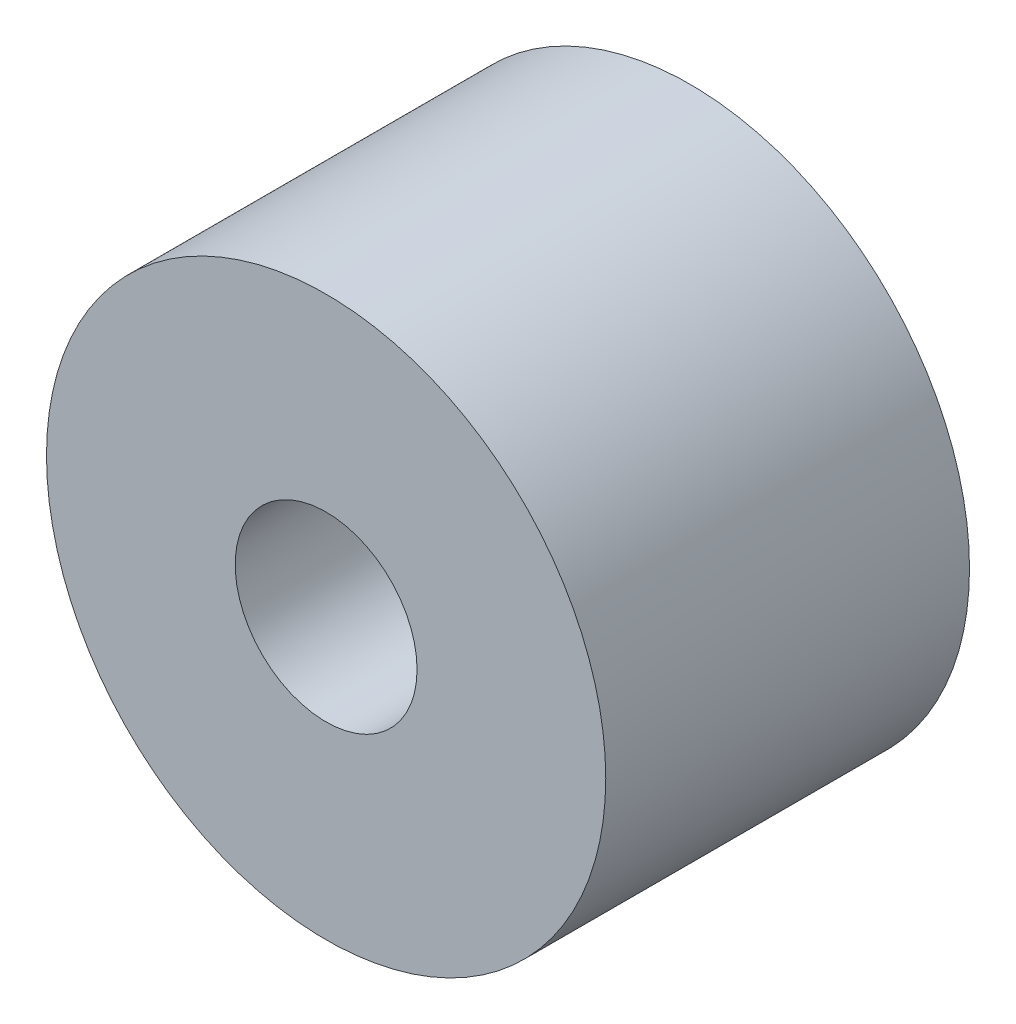
ISO-10303-21;
HEADER;
FILE_DESCRIPTION(('STEP AP214'),'2;1');
FILE_NAME('part.step','',(''),(''),'','','');
FILE_SCHEMA(('AUTOMOTIVE_DESIGN { 1 0 10303 214 1 1 1 1 }'));
ENDSEC;
DATA;
#1=APPLICATION_CONTEXT('core data for automotive mechanical design processes');
#2=APPLICATION_PROTOCOL_DEFINITION('international standard','automotive_design',2000,#1);
#3=PRODUCT_CONTEXT('',#1,'mechanical');
#4=PRODUCT('Part','Part','',(#3));
#5=PRODUCT_RELATED_PRODUCT_CATEGORY('part','',(#4));
#6=PRODUCT_DEFINITION_FORMATION('','',#4);
#7=PRODUCT_DEFINITION_CONTEXT('part definition',#1,'design');
#8=PRODUCT_DEFINITION('design','',#6,#7);
#9=PRODUCT_DEFINITION_SHAPE('','',#8);
#10=(LENGTH_UNIT() NAMED_UNIT(*) SI_UNIT(.MILLI.,.METRE.));
#11=(NAMED_UNIT(*) PLANE_ANGLE_UNIT() SI_UNIT($,.RADIAN.));
#12=(NAMED_UNIT(*) SI_UNIT($,.STERADIAN.) SOLID_ANGLE_UNIT());
#13=UNCERTAINTY_MEASURE_WITH_UNIT(LENGTH_MEASURE(1.E-05),#10,'distance_accuracy_value','');
#14=(GEOMETRIC_REPRESENTATION_CONTEXT(3) GLOBAL_UNCERTAINTY_ASSIGNED_CONTEXT((#13)) GLOBAL_UNIT_ASSIGNED_CONTEXT((#10,
#11,#12)) REPRESENTATION_CONTEXT('',''));
#15=CARTESIAN_POINT('',(0.,0.,0.));
#16=DIRECTION('',(0.,0.,1.));
#17=DIRECTION('',(1.,0.,0.));
#18=AXIS2_PLACEMENT_3D('',#15,#16,#17);
#19=CARTESIAN_POINT('',(0.,0.,8.));
#20=DIRECTION('',(0.,0.,-1.));
#21=DIRECTION('',(-1.,0.,0.));
#22=AXIS2_PLACEMENT_3D('',#19,#20,#21);
#23=CYLINDRICAL_SURFACE('',#22,6.15);
#24=CARTESIAN_POINT('',(0.,0.,8.));
#25=DIRECTION('',(0.,0.,1.));
#26=DIRECTION('',(1.,0.,0.));
#27=AXIS2_PLACEMENT_3D('',#24,#25,#26);
#28=CIRCLE('',#27,6.15);
#29=CARTESIAN_POINT('',(6.15,0.,8.));
#30=VERTEX_POINT('',#29);
#31=EDGE_CURVE('E10',#30,#30,#28,.T.);
#32=ORIENTED_EDGE('',*,*,#31,.F.);
#33=EDGE_LOOP('',(#32));
#34=FACE_BOUND('',#33,.T.);
#35=CARTESIAN_POINT('',(0.,0.,0.));
#36=DIRECTION('',(0.,0.,1.));
#37=DIRECTION('',(1.,0.,0.));
#38=AXIS2_PLACEMENT_3D('',#35,#36,#37);
#39=CIRCLE('',#38,6.15);
#40=CARTESIAN_POINT('',(6.15,0.,0.));
#41=VERTEX_POINT('',#40);
#42=EDGE_CURVE('E33',#41,#41,#39,.T.);
#43=ORIENTED_EDGE('',*,*,#42,.T.);
#44=EDGE_LOOP('',(#43));
#45=FACE_BOUND('',#44,.T.);
#46=ADVANCED_FACE('F30',(#34,#45),#23,.T.);
#47=CARTESIAN_POINT('',(0.,0.,8.));
#48=DIRECTION('',(0.,0.,1.));
#49=DIRECTION('',(1.,0.,0.));
#50=AXIS2_PLACEMENT_3D('',#47,#48,#49);
#51=PLANE('',#50);
#52=CARTESIAN_POINT('',(0.,0.,8.));
#53=DIRECTION('',(0.,0.,1.));
#54=DIRECTION('',(1.,0.,0.));
#55=AXIS2_PLACEMENT_3D('',#52,#53,#54);
#56=CIRCLE('',#55,2.);
#57=CARTESIAN_POINT('',(2.,0.,8.));
#58=VERTEX_POINT('',#57);
#59=EDGE_CURVE('E42',#58,#58,#56,.T.);
#60=ORIENTED_EDGE('',*,*,#59,.F.);
#61=EDGE_LOOP('',(#60));
#62=FACE_BOUND('',#61,.T.);
#63=ORIENTED_EDGE('',*,*,#31,.T.);
#64=EDGE_LOOP('',(#63));
#65=FACE_BOUND('',#64,.T.);
#66=ADVANCED_FACE('F57',(#62,#65),#51,.T.);
#67=CARTESIAN_POINT('',(0.,0.,0.));
#68=DIRECTION('',(0.,0.,1.));
#69=DIRECTION('',(1.,0.,0.));
#70=AXIS2_PLACEMENT_3D('',#67,#68,#69);
#71=PLANE('',#70);
#72=CARTESIAN_POINT('',(0.,0.,0.));
#73=DIRECTION('',(0.,0.,1.));
#74=DIRECTION('',(1.,0.,0.));
#75=AXIS2_PLACEMENT_3D('',#72,#73,#74);
#76=CIRCLE('',#75,2.);
#77=CARTESIAN_POINT('',(2.,0.,0.));
#78=VERTEX_POINT('',#77);
#79=EDGE_CURVE('E40',#78,#78,#76,.T.);
#80=ORIENTED_EDGE('',*,*,#79,.T.);
#81=EDGE_LOOP('',(#80));
#82=FACE_BOUND('',#81,.T.);
#83=ORIENTED_EDGE('',*,*,#42,.F.);
#84=EDGE_LOOP('',(#83));
#85=FACE_BOUND('',#84,.T.);
#86=ADVANCED_FACE('F48',(#82,#85),#71,.F.);
#87=CARTESIAN_POINT('',(0.,0.,0.));
#88=DIRECTION('',(0.,0.,1.));
#89=DIRECTION('',(1.,0.,0.));
#90=AXIS2_PLACEMENT_3D('',#87,#88,#89);
#91=CYLINDRICAL_SURFACE('',#90,2.);
#92=ORIENTED_EDGE('',*,*,#79,.F.);
#93=EDGE_LOOP('',(#92));
#94=FACE_BOUND('',#93,.T.);
#95=ORIENTED_EDGE('',*,*,#59,.T.);
#96=EDGE_LOOP('',(#95));
#97=FACE_BOUND('',#96,.T.);
#98=ADVANCED_FACE('F51',(#94,#97),#91,.F.);
#99=CLOSED_SHELL('',(#46,#66,#86,#98));
#100=MANIFOLD_SOLID_BREP('B2',#99);
#101=ADVANCED_BREP_SHAPE_REPRESENTATION('',(#18,#100),#14);
#102=SHAPE_DEFINITION_REPRESENTATION(#9,#101);
ENDSEC;
END-ISO-10303-21;
